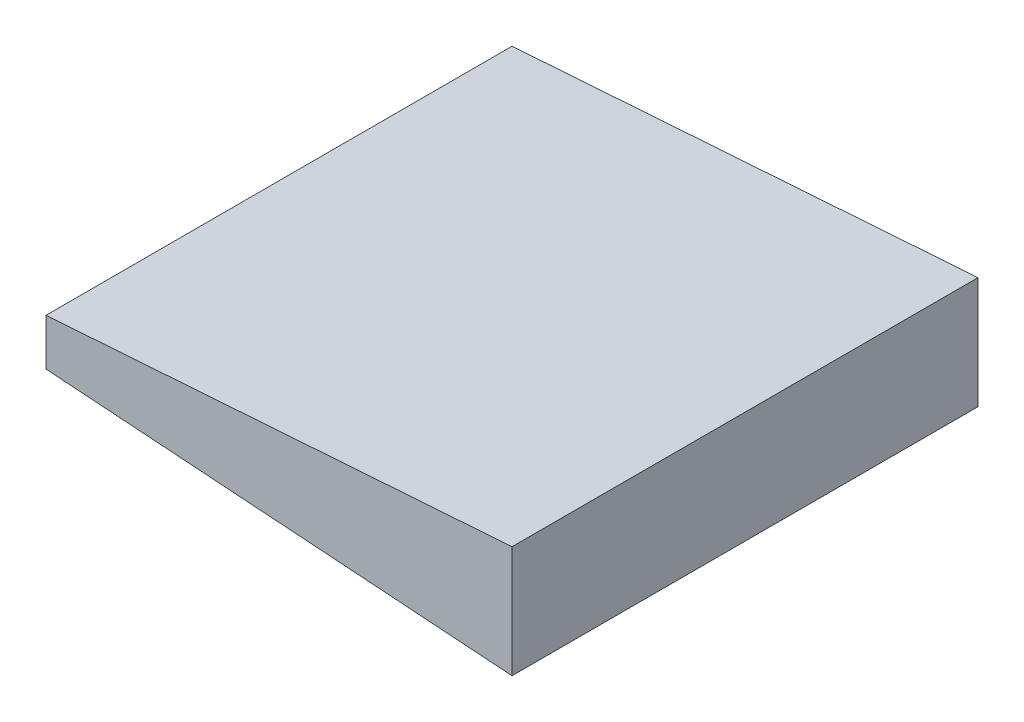
ISO-10303-21;
HEADER;
FILE_DESCRIPTION(('STEP AP214'),'2;1');
FILE_NAME('part.step','',(''),(''),'','','');
FILE_SCHEMA(('AUTOMOTIVE_DESIGN { 1 0 10303 214 1 1 1 1 }'));
ENDSEC;
DATA;
#1=APPLICATION_CONTEXT('core data for automotive mechanical design processes');
#2=APPLICATION_PROTOCOL_DEFINITION('international standard','automotive_design',2000,#1);
#3=PRODUCT_CONTEXT('',#1,'mechanical');
#4=PRODUCT('Part','Part','',(#3));
#5=PRODUCT_RELATED_PRODUCT_CATEGORY('part','',(#4));
#6=PRODUCT_DEFINITION_FORMATION('','',#4);
#7=PRODUCT_DEFINITION_CONTEXT('part definition',#1,'design');
#8=PRODUCT_DEFINITION('design','',#6,#7);
#9=PRODUCT_DEFINITION_SHAPE('','',#8);
#10=(LENGTH_UNIT() NAMED_UNIT(*) SI_UNIT(.MILLI.,.METRE.));
#11=(NAMED_UNIT(*) PLANE_ANGLE_UNIT() SI_UNIT($,.RADIAN.));
#12=(NAMED_UNIT(*) SI_UNIT($,.STERADIAN.) SOLID_ANGLE_UNIT());
#13=UNCERTAINTY_MEASURE_WITH_UNIT(LENGTH_MEASURE(1.E-05),#10,'distance_accuracy_value','');
#14=(GEOMETRIC_REPRESENTATION_CONTEXT(3) GLOBAL_UNCERTAINTY_ASSIGNED_CONTEXT((#13)) GLOBAL_UNIT_ASSIGNED_CONTEXT((#10,
#11,#12)) REPRESENTATION_CONTEXT('',''));
#15=CARTESIAN_POINT('',(0.,0.,0.));
#16=DIRECTION('',(0.,0.,1.));
#17=DIRECTION('',(1.,0.,0.));
#18=AXIS2_PLACEMENT_3D('',#15,#16,#17);
#19=CARTESIAN_POINT('',(-50.,5.,50.));
#20=DIRECTION('',(0.0697564737441221,-0.997564050259824,0.));
#21=DIRECTION('',(0.997564050259825,0.0697564737441221,0.));
#22=AXIS2_PLACEMENT_3D('',#19,#20,#21);
#23=PLANE('',#22);
#24=DIRECTION('',(-0.997564050259824,-0.0697564737441221,0.));
#25=VECTOR('',#24,1.);
#26=CARTESIAN_POINT('',(-50.,5.,-50.));
#27=LINE('',#26,#25);
#28=CARTESIAN_POINT('',(50.,11.9926811943507,-50.));
#29=VERTEX_POINT('',#28);
#30=CARTESIAN_POINT('',(-50.,5.,-50.));
#31=VERTEX_POINT('',#30);
#32=EDGE_CURVE('E96',#29,#31,#27,.T.);
#33=ORIENTED_EDGE('',*,*,#32,.T.);
#34=DIRECTION('',(0.,0.,-1.));
#35=VECTOR('',#34,1.);
#36=CARTESIAN_POINT('',(-50.,5.,50.));
#37=LINE('',#36,#35);
#38=CARTESIAN_POINT('',(-50.,5.,50.));
#39=VERTEX_POINT('',#38);
#40=EDGE_CURVE('E11',#39,#31,#37,.T.);
#41=ORIENTED_EDGE('',*,*,#40,.F.);
#42=DIRECTION('',(-0.997564050259824,-0.0697564737441221,0.));
#43=VECTOR('',#42,1.);
#44=CARTESIAN_POINT('',(-50.,5.,50.));
#45=LINE('',#44,#43);
#46=CARTESIAN_POINT('',(50.,11.9926811943507,50.));
#47=VERTEX_POINT('',#46);
#48=EDGE_CURVE('E84',#47,#39,#45,.T.);
#49=ORIENTED_EDGE('',*,*,#48,.F.);
#50=DIRECTION('',(0.,0.,-1.));
#51=VECTOR('',#50,1.);
#52=CARTESIAN_POINT('',(50.,11.9926811943507,50.));
#53=LINE('',#52,#51);
#54=EDGE_CURVE('E92',#47,#29,#53,.T.);
#55=ORIENTED_EDGE('',*,*,#54,.T.);
#56=EDGE_LOOP('',(#33,#41,#49,#55));
#57=FACE_BOUND('',#56,.T.);
#58=ADVANCED_FACE('F33',(#57),#23,.F.);
#59=CARTESIAN_POINT('',(-50.,5.,50.));
#60=DIRECTION('',(1.,0.,0.));
#61=DIRECTION('',(0.,0.,-1.));
#62=AXIS2_PLACEMENT_3D('',#59,#60,#61);
#63=PLANE('',#62);
#64=DIRECTION('',(0.,-1.,0.));
#65=VECTOR('',#64,1.);
#66=CARTESIAN_POINT('',(-50.,5.,-50.));
#67=LINE('',#66,#65);
#68=CARTESIAN_POINT('',(-50.,-5.,-50.));
#69=VERTEX_POINT('',#68);
#70=EDGE_CURVE('E88',#31,#69,#67,.T.);
#71=ORIENTED_EDGE('',*,*,#70,.T.);
#72=DIRECTION('',(0.,0.,-1.));
#73=VECTOR('',#72,1.);
#74=CARTESIAN_POINT('',(-50.,-5.,50.));
#75=LINE('',#74,#73);
#76=CARTESIAN_POINT('',(-50.,-5.,50.));
#77=VERTEX_POINT('',#76);
#78=EDGE_CURVE('E41',#77,#69,#75,.T.);
#79=ORIENTED_EDGE('',*,*,#78,.F.);
#80=DIRECTION('',(0.,-1.,0.));
#81=VECTOR('',#80,1.);
#82=CARTESIAN_POINT('',(-50.,5.,50.));
#83=LINE('',#82,#81);
#84=EDGE_CURVE('E79',#39,#77,#83,.T.);
#85=ORIENTED_EDGE('',*,*,#84,.F.);
#86=ORIENTED_EDGE('',*,*,#40,.T.);
#87=EDGE_LOOP('',(#71,#79,#85,#86));
#88=FACE_BOUND('',#87,.T.);
#89=ADVANCED_FACE('F87',(#88),#63,.F.);
#90=CARTESIAN_POINT('',(50.,-11.9926811943507,50.));
#91=DIRECTION('',(0.0697564737441221,0.997564050259824,0.));
#92=DIRECTION('',(-0.997564050259825,0.0697564737441221,0.));
#93=AXIS2_PLACEMENT_3D('',#90,#91,#92);
#94=PLANE('',#93);
#95=DIRECTION('',(0.997564050259824,-0.0697564737441221,0.));
#96=VECTOR('',#95,1.);
#97=CARTESIAN_POINT('',(50.,-11.9926811943507,-50.));
#98=LINE('',#97,#96);
#99=CARTESIAN_POINT('',(50.,-11.9926811943507,-50.));
#100=VERTEX_POINT('',#99);
#101=EDGE_CURVE('E66',#69,#100,#98,.T.);
#102=ORIENTED_EDGE('',*,*,#101,.T.);
#103=DIRECTION('',(0.,0.,-1.));
#104=VECTOR('',#103,1.);
#105=CARTESIAN_POINT('',(50.,-11.9926811943507,50.));
#106=LINE('',#105,#104);
#107=CARTESIAN_POINT('',(50.,-11.9926811943507,50.));
#108=VERTEX_POINT('',#107);
#109=EDGE_CURVE('E89',#108,#100,#106,.T.);
#110=ORIENTED_EDGE('',*,*,#109,.F.);
#111=DIRECTION('',(0.997564050259824,-0.0697564737441221,0.));
#112=VECTOR('',#111,1.);
#113=CARTESIAN_POINT('',(50.,-11.9926811943507,50.));
#114=LINE('',#113,#112);
#115=EDGE_CURVE('E82',#77,#108,#114,.T.);
#116=ORIENTED_EDGE('',*,*,#115,.F.);
#117=ORIENTED_EDGE('',*,*,#78,.T.);
#118=EDGE_LOOP('',(#102,#110,#116,#117));
#119=FACE_BOUND('',#118,.T.);
#120=ADVANCED_FACE('F90',(#119),#94,.F.);
#121=CARTESIAN_POINT('',(50.,11.9926811943507,50.));
#122=DIRECTION('',(-1.,0.,0.));
#123=DIRECTION('',(0.,0.,1.));
#124=AXIS2_PLACEMENT_3D('',#121,#122,#123);
#125=PLANE('',#124);
#126=DIRECTION('',(0.,1.,0.));
#127=VECTOR('',#126,1.);
#128=CARTESIAN_POINT('',(50.,11.9926811943507,-50.));
#129=LINE('',#128,#127);
#130=EDGE_CURVE('E72',#100,#29,#129,.T.);
#131=ORIENTED_EDGE('',*,*,#130,.T.);
#132=ORIENTED_EDGE('',*,*,#54,.F.);
#133=DIRECTION('',(0.,1.,0.));
#134=VECTOR('',#133,1.);
#135=CARTESIAN_POINT('',(50.,11.9926811943507,50.));
#136=LINE('',#135,#134);
#137=EDGE_CURVE('E49',#108,#47,#136,.T.);
#138=ORIENTED_EDGE('',*,*,#137,.F.);
#139=ORIENTED_EDGE('',*,*,#109,.T.);
#140=EDGE_LOOP('',(#131,#132,#138,#139));
#141=FACE_BOUND('',#140,.T.);
#142=ADVANCED_FACE('F103',(#141),#125,.F.);
#143=CARTESIAN_POINT('',(0.,0.,50.));
#144=DIRECTION('',(0.,0.,-1.));
#145=DIRECTION('',(-1.,0.,0.));
#146=AXIS2_PLACEMENT_3D('',#143,#144,#145);
#147=PLANE('',#146);
#148=ORIENTED_EDGE('',*,*,#48,.T.);
#149=ORIENTED_EDGE('',*,*,#84,.T.);
#150=ORIENTED_EDGE('',*,*,#115,.T.);
#151=ORIENTED_EDGE('',*,*,#137,.T.);
#152=EDGE_LOOP('',(#148,#149,#150,#151));
#153=FACE_BOUND('',#152,.T.);
#154=ADVANCED_FACE('F80',(#153),#147,.F.);
#155=CARTESIAN_POINT('',(0.,0.,-50.));
#156=DIRECTION('',(0.,0.,-1.));
#157=DIRECTION('',(-1.,0.,0.));
#158=AXIS2_PLACEMENT_3D('',#155,#156,#157);
#159=PLANE('',#158);
#160=ORIENTED_EDGE('',*,*,#32,.F.);
#161=ORIENTED_EDGE('',*,*,#130,.F.);
#162=ORIENTED_EDGE('',*,*,#101,.F.);
#163=ORIENTED_EDGE('',*,*,#70,.F.);
#164=EDGE_LOOP('',(#160,#161,#162,#163));
#165=FACE_BOUND('',#164,.T.);
#166=ADVANCED_FACE('F106',(#165),#159,.T.);
#167=CLOSED_SHELL('',(#58,#89,#120,#142,#154,#166));
#168=MANIFOLD_SOLID_BREP('B2',#167);
#169=ADVANCED_BREP_SHAPE_REPRESENTATION('',(#18,#168),#14);
#170=SHAPE_DEFINITION_REPRESENTATION(#9,#169);
ENDSEC;
END-ISO-10303-21;
